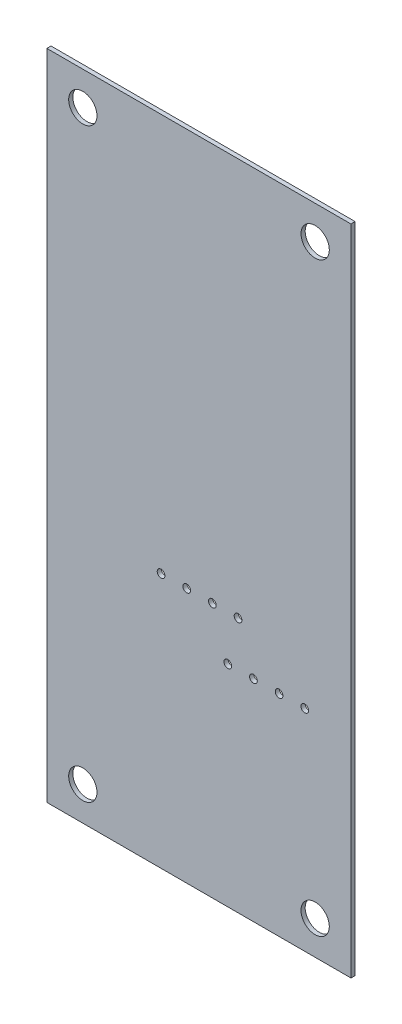
ISO-10303-21;
HEADER;
FILE_DESCRIPTION(('STEP AP214'),'2;1');
FILE_NAME('part.step','',(''),(''),'','','');
FILE_SCHEMA(('AUTOMOTIVE_DESIGN { 1 0 10303 214 1 1 1 1 }'));
ENDSEC;
DATA;
#1=APPLICATION_CONTEXT('core data for automotive mechanical design processes');
#2=APPLICATION_PROTOCOL_DEFINITION('international standard','automotive_design',2000,#1);
#3=PRODUCT_CONTEXT('',#1,'mechanical');
#4=PRODUCT('Part','Part','',(#3));
#5=PRODUCT_RELATED_PRODUCT_CATEGORY('part','',(#4));
#6=PRODUCT_DEFINITION_FORMATION('','',#4);
#7=PRODUCT_DEFINITION_CONTEXT('part definition',#1,'design');
#8=PRODUCT_DEFINITION('design','',#6,#7);
#9=PRODUCT_DEFINITION_SHAPE('','',#8);
#10=(LENGTH_UNIT() NAMED_UNIT(*) SI_UNIT(.MILLI.,.METRE.));
#11=(NAMED_UNIT(*) PLANE_ANGLE_UNIT() SI_UNIT($,.RADIAN.));
#12=(NAMED_UNIT(*) SI_UNIT($,.STERADIAN.) SOLID_ANGLE_UNIT());
#13=UNCERTAINTY_MEASURE_WITH_UNIT(LENGTH_MEASURE(1.E-05),#10,'distance_accuracy_value','');
#14=(GEOMETRIC_REPRESENTATION_CONTEXT(3) GLOBAL_UNCERTAINTY_ASSIGNED_CONTEXT((#13)) GLOBAL_UNIT_ASSIGNED_CONTEXT((#10,
#11,#12)) REPRESENTATION_CONTEXT('',''));
#15=CARTESIAN_POINT('',(0.,0.,0.));
#16=DIRECTION('',(0.,0.,1.));
#17=DIRECTION('',(1.,0.,0.));
#18=AXIS2_PLACEMENT_3D('',#15,#16,#17);
#19=CARTESIAN_POINT('',(0.,0.127,0.));
#20=DIRECTION('',(0.,1.,0.));
#21=DIRECTION('',(1.,0.,0.));
#22=AXIS2_PLACEMENT_3D('',#19,#20,#21);
#23=PLANE('',#22);
#24=DIRECTION('',(1.,0.,0.));
#25=VECTOR('',#24,1.);
#26=CARTESIAN_POINT('',(0.,0.127,0.41148));
#27=LINE('',#26,#25);
#28=CARTESIAN_POINT('',(0.,0.127,0.41148));
#29=VERTEX_POINT('',#28);
#30=CARTESIAN_POINT('',(30.099,0.127,0.41148));
#31=VERTEX_POINT('',#30);
#32=EDGE_CURVE('E10',#29,#31,#27,.T.);
#33=ORIENTED_EDGE('',*,*,#32,.F.);
#34=DIRECTION('',(0.,0.,1.));
#35=VECTOR('',#34,1.);
#36=CARTESIAN_POINT('',(0.,0.127,0.));
#37=LINE('',#36,#35);
#38=CARTESIAN_POINT('',(0.,0.127,0.));
#39=VERTEX_POINT('',#38);
#40=EDGE_CURVE('E23',#39,#29,#37,.T.);
#41=ORIENTED_EDGE('',*,*,#40,.F.);
#42=DIRECTION('',(1.,0.,0.));
#43=VECTOR('',#42,1.);
#44=CARTESIAN_POINT('',(0.,0.127,0.));
#45=LINE('',#44,#43);
#46=CARTESIAN_POINT('',(30.099,0.127,0.));
#47=VERTEX_POINT('',#46);
#48=EDGE_CURVE('E249',#39,#47,#45,.T.);
#49=ORIENTED_EDGE('',*,*,#48,.T.);
#50=DIRECTION('',(0.,0.,1.));
#51=VECTOR('',#50,1.);
#52=CARTESIAN_POINT('',(30.099,0.127,0.));
#53=LINE('',#52,#51);
#54=EDGE_CURVE('E36',#47,#31,#53,.T.);
#55=ORIENTED_EDGE('',*,*,#54,.T.);
#56=EDGE_LOOP('',(#33,#41,#49,#55));
#57=FACE_BOUND('',#56,.T.);
#58=ADVANCED_FACE('F16',(#57),#23,.F.);
#59=CARTESIAN_POINT('',(30.099,0.127,0.));
#60=DIRECTION('',(-1.,0.,0.));
#61=DIRECTION('',(0.,1.,0.));
#62=AXIS2_PLACEMENT_3D('',#59,#60,#61);
#63=PLANE('',#62);
#64=DIRECTION('',(0.,1.,0.));
#65=VECTOR('',#64,1.);
#66=CARTESIAN_POINT('',(30.099,0.127,0.41148));
#67=LINE('',#66,#65);
#68=CARTESIAN_POINT('',(30.099,64.77,0.41148));
#69=VERTEX_POINT('',#68);
#70=EDGE_CURVE('E245',#31,#69,#67,.T.);
#71=ORIENTED_EDGE('',*,*,#70,.F.);
#72=ORIENTED_EDGE('',*,*,#54,.F.);
#73=DIRECTION('',(0.,1.,0.));
#74=VECTOR('',#73,1.);
#75=CARTESIAN_POINT('',(30.099,0.127,0.));
#76=LINE('',#75,#74);
#77=CARTESIAN_POINT('',(30.099,64.77,0.));
#78=VERTEX_POINT('',#77);
#79=EDGE_CURVE('E242',#47,#78,#76,.T.);
#80=ORIENTED_EDGE('',*,*,#79,.T.);
#81=DIRECTION('',(0.,0.,1.));
#82=VECTOR('',#81,1.);
#83=CARTESIAN_POINT('',(30.099,64.77,0.));
#84=LINE('',#83,#82);
#85=EDGE_CURVE('E240',#78,#69,#84,.T.);
#86=ORIENTED_EDGE('',*,*,#85,.T.);
#87=EDGE_LOOP('',(#71,#72,#80,#86));
#88=FACE_BOUND('',#87,.T.);
#89=ADVANCED_FACE('F258',(#88),#63,.F.);
#90=CARTESIAN_POINT('',(30.099,64.77,0.));
#91=DIRECTION('',(0.,-1.,0.));
#92=DIRECTION('',(-1.,0.,0.));
#93=AXIS2_PLACEMENT_3D('',#90,#91,#92);
#94=PLANE('',#93);
#95=DIRECTION('',(-1.,0.,0.));
#96=VECTOR('',#95,1.);
#97=CARTESIAN_POINT('',(30.099,64.77,0.41148));
#98=LINE('',#97,#96);
#99=CARTESIAN_POINT('',(0.,64.77,0.41148));
#100=VERTEX_POINT('',#99);
#101=EDGE_CURVE('E237',#69,#100,#98,.T.);
#102=ORIENTED_EDGE('',*,*,#101,.F.);
#103=ORIENTED_EDGE('',*,*,#85,.F.);
#104=DIRECTION('',(-1.,0.,0.));
#105=VECTOR('',#104,1.);
#106=CARTESIAN_POINT('',(30.099,64.77,0.));
#107=LINE('',#106,#105);
#108=CARTESIAN_POINT('',(0.,64.77,0.));
#109=VERTEX_POINT('',#108);
#110=EDGE_CURVE('E234',#78,#109,#107,.T.);
#111=ORIENTED_EDGE('',*,*,#110,.T.);
#112=DIRECTION('',(0.,0.,1.));
#113=VECTOR('',#112,1.);
#114=CARTESIAN_POINT('',(0.,64.77,0.));
#115=LINE('',#114,#113);
#116=EDGE_CURVE('E232',#109,#100,#115,.T.);
#117=ORIENTED_EDGE('',*,*,#116,.T.);
#118=EDGE_LOOP('',(#102,#103,#111,#117));
#119=FACE_BOUND('',#118,.T.);
#120=ADVANCED_FACE('F264',(#119),#94,.F.);
#121=CARTESIAN_POINT('',(0.,64.77,0.));
#122=DIRECTION('',(1.,0.,0.));
#123=DIRECTION('',(0.,-1.,0.));
#124=AXIS2_PLACEMENT_3D('',#121,#122,#123);
#125=PLANE('',#124);
#126=DIRECTION('',(0.,-1.,0.));
#127=VECTOR('',#126,1.);
#128=CARTESIAN_POINT('',(0.,64.77,0.41148));
#129=LINE('',#128,#127);
#130=EDGE_CURVE('E229',#100,#29,#129,.T.);
#131=ORIENTED_EDGE('',*,*,#130,.F.);
#132=ORIENTED_EDGE('',*,*,#116,.F.);
#133=DIRECTION('',(0.,-1.,0.));
#134=VECTOR('',#133,1.);
#135=CARTESIAN_POINT('',(0.,64.77,0.));
#136=LINE('',#135,#134);
#137=EDGE_CURVE('E227',#109,#39,#136,.T.);
#138=ORIENTED_EDGE('',*,*,#137,.T.);
#139=ORIENTED_EDGE('',*,*,#40,.T.);
#140=EDGE_LOOP('',(#131,#132,#138,#139));
#141=FACE_BOUND('',#140,.T.);
#142=ADVANCED_FACE('F265',(#141),#125,.F.);
#143=CARTESIAN_POINT('',(3.556,3.468,0.));
#144=DIRECTION('',(0.,0.,-1.));
#145=DIRECTION('',(1.,0.,0.));
#146=AXIS2_PLACEMENT_3D('',#143,#144,#145);
#147=CYLINDRICAL_SURFACE('',#146,1.4);
#148=DIRECTION('',(0.,0.,1.));
#149=VECTOR('',#148,1.);
#150=CARTESIAN_POINT('',(4.956,3.468,0.));
#151=LINE('',#150,#149);
#152=CARTESIAN_POINT('',(4.956,3.468,0.));
#153=VERTEX_POINT('',#152);
#154=CARTESIAN_POINT('',(4.956,3.468,0.41148));
#155=VERTEX_POINT('',#154);
#156=EDGE_CURVE('E225',#153,#155,#151,.T.);
#157=ORIENTED_EDGE('',*,*,#156,.T.);
#158=CARTESIAN_POINT('',(3.556,3.468,0.41148));
#159=DIRECTION('',(0.,0.,1.));
#160=DIRECTION('',(1.,0.,0.));
#161=AXIS2_PLACEMENT_3D('',#158,#159,#160);
#162=CIRCLE('',#161,1.4);
#163=EDGE_CURVE('E222',#155,#155,#162,.T.);
#164=ORIENTED_EDGE('',*,*,#163,.T.);
#165=ORIENTED_EDGE('',*,*,#156,.F.);
#166=CARTESIAN_POINT('',(3.556,3.468,0.));
#167=DIRECTION('',(0.,0.,1.));
#168=DIRECTION('',(1.,0.,0.));
#169=AXIS2_PLACEMENT_3D('',#166,#167,#168);
#170=CIRCLE('',#169,1.4);
#171=EDGE_CURVE('E219',#153,#153,#170,.T.);
#172=ORIENTED_EDGE('',*,*,#171,.F.);
#173=EDGE_LOOP('',(#157,#164,#165,#172));
#174=FACE_BOUND('',#173,.T.);
#175=ADVANCED_FACE('F267',(#174),#147,.F.);
#176=CARTESIAN_POINT('',(17.907,20.955,0.));
#177=DIRECTION('',(0.,0.,-1.));
#178=DIRECTION('',(1.,0.,0.));
#179=AXIS2_PLACEMENT_3D('',#176,#177,#178);
#180=CYLINDRICAL_SURFACE('',#179,0.381);
#181=DIRECTION('',(0.,0.,1.));
#182=VECTOR('',#181,1.);
#183=CARTESIAN_POINT('',(18.288,20.955,0.));
#184=LINE('',#183,#182);
#185=CARTESIAN_POINT('',(18.288,20.955,0.));
#186=VERTEX_POINT('',#185);
#187=CARTESIAN_POINT('',(18.288,20.955,0.41148));
#188=VERTEX_POINT('',#187);
#189=EDGE_CURVE('E217',#186,#188,#184,.T.);
#190=ORIENTED_EDGE('',*,*,#189,.T.);
#191=CARTESIAN_POINT('',(17.907,20.955,0.41148));
#192=DIRECTION('',(0.,0.,1.));
#193=DIRECTION('',(1.,0.,0.));
#194=AXIS2_PLACEMENT_3D('',#191,#192,#193);
#195=CIRCLE('',#194,0.381);
#196=EDGE_CURVE('E214',#188,#188,#195,.T.);
#197=ORIENTED_EDGE('',*,*,#196,.T.);
#198=ORIENTED_EDGE('',*,*,#189,.F.);
#199=CARTESIAN_POINT('',(17.907,20.955,0.));
#200=DIRECTION('',(0.,0.,1.));
#201=DIRECTION('',(1.,0.,0.));
#202=AXIS2_PLACEMENT_3D('',#199,#200,#201);
#203=CIRCLE('',#202,0.381);
#204=EDGE_CURVE('E211',#186,#186,#203,.T.);
#205=ORIENTED_EDGE('',*,*,#204,.F.);
#206=EDGE_LOOP('',(#190,#197,#198,#205));
#207=FACE_BOUND('',#206,.T.);
#208=ADVANCED_FACE('F274',(#207),#180,.F.);
#209=CARTESIAN_POINT('',(11.303,25.4,0.));
#210=DIRECTION('',(0.,0.,-1.));
#211=DIRECTION('',(1.,0.,0.));
#212=AXIS2_PLACEMENT_3D('',#209,#210,#211);
#213=CYLINDRICAL_SURFACE('',#212,0.381);
#214=DIRECTION('',(0.,0.,1.));
#215=VECTOR('',#214,1.);
#216=CARTESIAN_POINT('',(11.684,25.4,0.));
#217=LINE('',#216,#215);
#218=CARTESIAN_POINT('',(11.684,25.4,0.));
#219=VERTEX_POINT('',#218);
#220=CARTESIAN_POINT('',(11.684,25.4,0.41148));
#221=VERTEX_POINT('',#220);
#222=EDGE_CURVE('E209',#219,#221,#217,.T.);
#223=ORIENTED_EDGE('',*,*,#222,.T.);
#224=CARTESIAN_POINT('',(11.303,25.4,0.41148));
#225=DIRECTION('',(0.,0.,1.));
#226=DIRECTION('',(1.,0.,0.));
#227=AXIS2_PLACEMENT_3D('',#224,#225,#226);
#228=CIRCLE('',#227,0.381);
#229=EDGE_CURVE('E206',#221,#221,#228,.T.);
#230=ORIENTED_EDGE('',*,*,#229,.T.);
#231=ORIENTED_EDGE('',*,*,#222,.F.);
#232=CARTESIAN_POINT('',(11.303,25.4,0.));
#233=DIRECTION('',(0.,0.,1.));
#234=DIRECTION('',(1.,0.,0.));
#235=AXIS2_PLACEMENT_3D('',#232,#233,#234);
#236=CIRCLE('',#235,0.381);
#237=EDGE_CURVE('E203',#219,#219,#236,.T.);
#238=ORIENTED_EDGE('',*,*,#237,.F.);
#239=EDGE_LOOP('',(#223,#230,#231,#238));
#240=FACE_BOUND('',#239,.T.);
#241=ADVANCED_FACE('F312',(#240),#213,.F.);
#242=CARTESIAN_POINT('',(3.556,61.468,0.));
#243=DIRECTION('',(0.,0.,-1.));
#244=DIRECTION('',(1.,0.,0.));
#245=AXIS2_PLACEMENT_3D('',#242,#243,#244);
#246=CYLINDRICAL_SURFACE('',#245,1.4);
#247=DIRECTION('',(0.,0.,1.));
#248=VECTOR('',#247,1.);
#249=CARTESIAN_POINT('',(4.956,61.468,0.));
#250=LINE('',#249,#248);
#251=CARTESIAN_POINT('',(4.956,61.468,0.));
#252=VERTEX_POINT('',#251);
#253=CARTESIAN_POINT('',(4.956,61.468,0.41148));
#254=VERTEX_POINT('',#253);
#255=EDGE_CURVE('E201',#252,#254,#250,.T.);
#256=ORIENTED_EDGE('',*,*,#255,.T.);
#257=CARTESIAN_POINT('',(3.556,61.468,0.41148));
#258=DIRECTION('',(0.,0.,1.));
#259=DIRECTION('',(1.,0.,0.));
#260=AXIS2_PLACEMENT_3D('',#257,#258,#259);
#261=CIRCLE('',#260,1.4);
#262=EDGE_CURVE('E198',#254,#254,#261,.T.);
#263=ORIENTED_EDGE('',*,*,#262,.T.);
#264=ORIENTED_EDGE('',*,*,#255,.F.);
#265=CARTESIAN_POINT('',(3.556,61.468,0.));
#266=DIRECTION('',(0.,0.,1.));
#267=DIRECTION('',(1.,0.,0.));
#268=AXIS2_PLACEMENT_3D('',#265,#266,#267);
#269=CIRCLE('',#268,1.4);
#270=EDGE_CURVE('E195',#252,#252,#269,.T.);
#271=ORIENTED_EDGE('',*,*,#270,.F.);
#272=EDGE_LOOP('',(#256,#263,#264,#271));
#273=FACE_BOUND('',#272,.T.);
#274=ADVANCED_FACE('F322',(#273),#246,.F.);
#275=CARTESIAN_POINT('',(16.383,25.4,0.));
#276=DIRECTION('',(0.,0.,-1.));
#277=DIRECTION('',(1.,0.,0.));
#278=AXIS2_PLACEMENT_3D('',#275,#276,#277);
#279=CYLINDRICAL_SURFACE('',#278,0.381);
#280=DIRECTION('',(0.,0.,1.));
#281=VECTOR('',#280,1.);
#282=CARTESIAN_POINT('',(16.764,25.4,0.));
#283=LINE('',#282,#281);
#284=CARTESIAN_POINT('',(16.764,25.4,0.));
#285=VERTEX_POINT('',#284);
#286=CARTESIAN_POINT('',(16.764,25.4,0.41148));
#287=VERTEX_POINT('',#286);
#288=EDGE_CURVE('E193',#285,#287,#283,.T.);
#289=ORIENTED_EDGE('',*,*,#288,.T.);
#290=CARTESIAN_POINT('',(16.383,25.4,0.41148));
#291=DIRECTION('',(0.,0.,1.));
#292=DIRECTION('',(1.,0.,0.));
#293=AXIS2_PLACEMENT_3D('',#290,#291,#292);
#294=CIRCLE('',#293,0.381);
#295=EDGE_CURVE('E190',#287,#287,#294,.T.);
#296=ORIENTED_EDGE('',*,*,#295,.T.);
#297=ORIENTED_EDGE('',*,*,#288,.F.);
#298=CARTESIAN_POINT('',(16.383,25.4,0.));
#299=DIRECTION('',(0.,0.,1.));
#300=DIRECTION('',(1.,0.,0.));
#301=AXIS2_PLACEMENT_3D('',#298,#299,#300);
#302=CIRCLE('',#301,0.381);
#303=EDGE_CURVE('E187',#285,#285,#302,.T.);
#304=ORIENTED_EDGE('',*,*,#303,.F.);
#305=EDGE_LOOP('',(#289,#296,#297,#304));
#306=FACE_BOUND('',#305,.T.);
#307=ADVANCED_FACE('F332',(#306),#279,.F.);
#308=CARTESIAN_POINT('',(13.843,25.4,0.));
#309=DIRECTION('',(0.,0.,-1.));
#310=DIRECTION('',(1.,0.,0.));
#311=AXIS2_PLACEMENT_3D('',#308,#309,#310);
#312=CYLINDRICAL_SURFACE('',#311,0.381);
#313=DIRECTION('',(0.,0.,1.));
#314=VECTOR('',#313,1.);
#315=CARTESIAN_POINT('',(14.224,25.4,0.));
#316=LINE('',#315,#314);
#317=CARTESIAN_POINT('',(14.224,25.4,0.));
#318=VERTEX_POINT('',#317);
#319=CARTESIAN_POINT('',(14.224,25.4,0.41148));
#320=VERTEX_POINT('',#319);
#321=EDGE_CURVE('E185',#318,#320,#316,.T.);
#322=ORIENTED_EDGE('',*,*,#321,.T.);
#323=CARTESIAN_POINT('',(13.843,25.4,0.41148));
#324=DIRECTION('',(0.,0.,1.));
#325=DIRECTION('',(1.,0.,0.));
#326=AXIS2_PLACEMENT_3D('',#323,#324,#325);
#327=CIRCLE('',#326,0.381);
#328=EDGE_CURVE('E182',#320,#320,#327,.T.);
#329=ORIENTED_EDGE('',*,*,#328,.T.);
#330=ORIENTED_EDGE('',*,*,#321,.F.);
#331=CARTESIAN_POINT('',(13.843,25.4,0.));
#332=DIRECTION('',(0.,0.,1.));
#333=DIRECTION('',(1.,0.,0.));
#334=AXIS2_PLACEMENT_3D('',#331,#332,#333);
#335=CIRCLE('',#334,0.381);
#336=EDGE_CURVE('E179',#318,#318,#335,.T.);
#337=ORIENTED_EDGE('',*,*,#336,.F.);
#338=EDGE_LOOP('',(#322,#329,#330,#337));
#339=FACE_BOUND('',#338,.T.);
#340=ADVANCED_FACE('F342',(#339),#312,.F.);
#341=CARTESIAN_POINT('',(20.447,20.955,0.));
#342=DIRECTION('',(0.,0.,-1.));
#343=DIRECTION('',(1.,0.,0.));
#344=AXIS2_PLACEMENT_3D('',#341,#342,#343);
#345=CYLINDRICAL_SURFACE('',#344,0.381);
#346=DIRECTION('',(0.,0.,1.));
#347=VECTOR('',#346,1.);
#348=CARTESIAN_POINT('',(20.828,20.955,0.));
#349=LINE('',#348,#347);
#350=CARTESIAN_POINT('',(20.828,20.955,0.));
#351=VERTEX_POINT('',#350);
#352=CARTESIAN_POINT('',(20.828,20.955,0.41148));
#353=VERTEX_POINT('',#352);
#354=EDGE_CURVE('E177',#351,#353,#349,.T.);
#355=ORIENTED_EDGE('',*,*,#354,.T.);
#356=CARTESIAN_POINT('',(20.447,20.955,0.41148));
#357=DIRECTION('',(0.,0.,1.));
#358=DIRECTION('',(1.,0.,0.));
#359=AXIS2_PLACEMENT_3D('',#356,#357,#358);
#360=CIRCLE('',#359,0.381);
#361=EDGE_CURVE('E174',#353,#353,#360,.T.);
#362=ORIENTED_EDGE('',*,*,#361,.T.);
#363=ORIENTED_EDGE('',*,*,#354,.F.);
#364=CARTESIAN_POINT('',(20.447,20.955,0.));
#365=DIRECTION('',(0.,0.,1.));
#366=DIRECTION('',(1.,0.,0.));
#367=AXIS2_PLACEMENT_3D('',#364,#365,#366);
#368=CIRCLE('',#367,0.381);
#369=EDGE_CURVE('E171',#351,#351,#368,.T.);
#370=ORIENTED_EDGE('',*,*,#369,.F.);
#371=EDGE_LOOP('',(#355,#362,#363,#370));
#372=FACE_BOUND('',#371,.T.);
#373=ADVANCED_FACE('F352',(#372),#345,.F.);
#374=CARTESIAN_POINT('',(26.556,3.468,0.));
#375=DIRECTION('',(0.,0.,-1.));
#376=DIRECTION('',(1.,0.,0.));
#377=AXIS2_PLACEMENT_3D('',#374,#375,#376);
#378=CYLINDRICAL_SURFACE('',#377,1.4);
#379=DIRECTION('',(0.,0.,1.));
#380=VECTOR('',#379,1.);
#381=CARTESIAN_POINT('',(27.956,3.468,0.));
#382=LINE('',#381,#380);
#383=CARTESIAN_POINT('',(27.956,3.468,0.));
#384=VERTEX_POINT('',#383);
#385=CARTESIAN_POINT('',(27.956,3.468,0.41148));
#386=VERTEX_POINT('',#385);
#387=EDGE_CURVE('E169',#384,#386,#382,.T.);
#388=ORIENTED_EDGE('',*,*,#387,.T.);
#389=CARTESIAN_POINT('',(26.556,3.468,0.41148));
#390=DIRECTION('',(0.,0.,1.));
#391=DIRECTION('',(1.,0.,0.));
#392=AXIS2_PLACEMENT_3D('',#389,#390,#391);
#393=CIRCLE('',#392,1.4);
#394=EDGE_CURVE('E166',#386,#386,#393,.T.);
#395=ORIENTED_EDGE('',*,*,#394,.T.);
#396=ORIENTED_EDGE('',*,*,#387,.F.);
#397=CARTESIAN_POINT('',(26.556,3.468,0.));
#398=DIRECTION('',(0.,0.,1.));
#399=DIRECTION('',(1.,0.,0.));
#400=AXIS2_PLACEMENT_3D('',#397,#398,#399);
#401=CIRCLE('',#400,1.4);
#402=EDGE_CURVE('E163',#384,#384,#401,.T.);
#403=ORIENTED_EDGE('',*,*,#402,.F.);
#404=EDGE_LOOP('',(#388,#395,#396,#403));
#405=FACE_BOUND('',#404,.T.);
#406=ADVANCED_FACE('F362',(#405),#378,.F.);
#407=CARTESIAN_POINT('',(22.987,20.955,0.));
#408=DIRECTION('',(0.,0.,-1.));
#409=DIRECTION('',(1.,0.,0.));
#410=AXIS2_PLACEMENT_3D('',#407,#408,#409);
#411=CYLINDRICAL_SURFACE('',#410,0.381);
#412=DIRECTION('',(0.,0.,1.));
#413=VECTOR('',#412,1.);
#414=CARTESIAN_POINT('',(23.368,20.955,0.));
#415=LINE('',#414,#413);
#416=CARTESIAN_POINT('',(23.368,20.955,0.));
#417=VERTEX_POINT('',#416);
#418=CARTESIAN_POINT('',(23.368,20.955,0.41148));
#419=VERTEX_POINT('',#418);
#420=EDGE_CURVE('E161',#417,#419,#415,.T.);
#421=ORIENTED_EDGE('',*,*,#420,.T.);
#422=CARTESIAN_POINT('',(22.987,20.955,0.41148));
#423=DIRECTION('',(0.,0.,1.));
#424=DIRECTION('',(1.,0.,0.));
#425=AXIS2_PLACEMENT_3D('',#422,#423,#424);
#426=CIRCLE('',#425,0.381);
#427=EDGE_CURVE('E158',#419,#419,#426,.T.);
#428=ORIENTED_EDGE('',*,*,#427,.T.);
#429=ORIENTED_EDGE('',*,*,#420,.F.);
#430=CARTESIAN_POINT('',(22.987,20.955,0.));
#431=DIRECTION('',(0.,0.,1.));
#432=DIRECTION('',(1.,0.,0.));
#433=AXIS2_PLACEMENT_3D('',#430,#431,#432);
#434=CIRCLE('',#433,0.381);
#435=EDGE_CURVE('E155',#417,#417,#434,.T.);
#436=ORIENTED_EDGE('',*,*,#435,.F.);
#437=EDGE_LOOP('',(#421,#428,#429,#436));
#438=FACE_BOUND('',#437,.T.);
#439=ADVANCED_FACE('F372',(#438),#411,.F.);
#440=CARTESIAN_POINT('',(18.923,25.4,0.));
#441=DIRECTION('',(0.,0.,-1.));
#442=DIRECTION('',(1.,0.,0.));
#443=AXIS2_PLACEMENT_3D('',#440,#441,#442);
#444=CYLINDRICAL_SURFACE('',#443,0.381);
#445=DIRECTION('',(0.,0.,1.));
#446=VECTOR('',#445,1.);
#447=CARTESIAN_POINT('',(19.304,25.4,0.));
#448=LINE('',#447,#446);
#449=CARTESIAN_POINT('',(19.304,25.4,0.));
#450=VERTEX_POINT('',#449);
#451=CARTESIAN_POINT('',(19.304,25.4,0.41148));
#452=VERTEX_POINT('',#451);
#453=EDGE_CURVE('E153',#450,#452,#448,.T.);
#454=ORIENTED_EDGE('',*,*,#453,.T.);
#455=CARTESIAN_POINT('',(18.923,25.4,0.41148));
#456=DIRECTION('',(0.,0.,1.));
#457=DIRECTION('',(1.,0.,0.));
#458=AXIS2_PLACEMENT_3D('',#455,#456,#457);
#459=CIRCLE('',#458,0.381);
#460=EDGE_CURVE('E150',#452,#452,#459,.T.);
#461=ORIENTED_EDGE('',*,*,#460,.T.);
#462=ORIENTED_EDGE('',*,*,#453,.F.);
#463=CARTESIAN_POINT('',(18.923,25.4,0.));
#464=DIRECTION('',(0.,0.,1.));
#465=DIRECTION('',(1.,0.,0.));
#466=AXIS2_PLACEMENT_3D('',#463,#464,#465);
#467=CIRCLE('',#466,0.381);
#468=EDGE_CURVE('E147',#450,#450,#467,.T.);
#469=ORIENTED_EDGE('',*,*,#468,.F.);
#470=EDGE_LOOP('',(#454,#461,#462,#469));
#471=FACE_BOUND('',#470,.T.);
#472=ADVANCED_FACE('F382',(#471),#444,.F.);
#473=CARTESIAN_POINT('',(25.527,20.955,0.));
#474=DIRECTION('',(0.,0.,-1.));
#475=DIRECTION('',(1.,0.,0.));
#476=AXIS2_PLACEMENT_3D('',#473,#474,#475);
#477=CYLINDRICAL_SURFACE('',#476,0.381);
#478=DIRECTION('',(0.,0.,1.));
#479=VECTOR('',#478,1.);
#480=CARTESIAN_POINT('',(25.908,20.955,0.));
#481=LINE('',#480,#479);
#482=CARTESIAN_POINT('',(25.908,20.955,0.));
#483=VERTEX_POINT('',#482);
#484=CARTESIAN_POINT('',(25.908,20.955,0.41148));
#485=VERTEX_POINT('',#484);
#486=EDGE_CURVE('E145',#483,#485,#481,.T.);
#487=ORIENTED_EDGE('',*,*,#486,.T.);
#488=CARTESIAN_POINT('',(25.527,20.955,0.41148));
#489=DIRECTION('',(0.,0.,1.));
#490=DIRECTION('',(1.,0.,0.));
#491=AXIS2_PLACEMENT_3D('',#488,#489,#490);
#492=CIRCLE('',#491,0.381);
#493=EDGE_CURVE('E142',#485,#485,#492,.T.);
#494=ORIENTED_EDGE('',*,*,#493,.T.);
#495=ORIENTED_EDGE('',*,*,#486,.F.);
#496=CARTESIAN_POINT('',(25.527,20.955,0.));
#497=DIRECTION('',(0.,0.,1.));
#498=DIRECTION('',(1.,0.,0.));
#499=AXIS2_PLACEMENT_3D('',#496,#497,#498);
#500=CIRCLE('',#499,0.381);
#501=EDGE_CURVE('E133',#483,#483,#500,.T.);
#502=ORIENTED_EDGE('',*,*,#501,.F.);
#503=EDGE_LOOP('',(#487,#494,#495,#502));
#504=FACE_BOUND('',#503,.T.);
#505=ADVANCED_FACE('F392',(#504),#477,.F.);
#506=CARTESIAN_POINT('',(26.556,61.468,0.));
#507=DIRECTION('',(0.,0.,-1.));
#508=DIRECTION('',(1.,0.,0.));
#509=AXIS2_PLACEMENT_3D('',#506,#507,#508);
#510=CYLINDRICAL_SURFACE('',#509,1.4);
#511=DIRECTION('',(0.,0.,1.));
#512=VECTOR('',#511,1.);
#513=CARTESIAN_POINT('',(27.956,61.468,0.));
#514=LINE('',#513,#512);
#515=CARTESIAN_POINT('',(27.956,61.468,0.));
#516=VERTEX_POINT('',#515);
#517=CARTESIAN_POINT('',(27.956,61.468,0.41148));
#518=VERTEX_POINT('',#517);
#519=EDGE_CURVE('E127',#516,#518,#514,.T.);
#520=ORIENTED_EDGE('',*,*,#519,.T.);
#521=CARTESIAN_POINT('',(26.556,61.468,0.41148));
#522=DIRECTION('',(0.,0.,1.));
#523=DIRECTION('',(1.,0.,0.));
#524=AXIS2_PLACEMENT_3D('',#521,#522,#523);
#525=CIRCLE('',#524,1.4);
#526=EDGE_CURVE('E132',#518,#518,#525,.T.);
#527=ORIENTED_EDGE('',*,*,#526,.T.);
#528=ORIENTED_EDGE('',*,*,#519,.F.);
#529=CARTESIAN_POINT('',(26.556,61.468,0.));
#530=DIRECTION('',(0.,0.,1.));
#531=DIRECTION('',(1.,0.,0.));
#532=AXIS2_PLACEMENT_3D('',#529,#530,#531);
#533=CIRCLE('',#532,1.4);
#534=EDGE_CURVE('E130',#516,#516,#533,.T.);
#535=ORIENTED_EDGE('',*,*,#534,.F.);
#536=EDGE_LOOP('',(#520,#527,#528,#535));
#537=FACE_BOUND('',#536,.T.);
#538=ADVANCED_FACE('F129',(#537),#510,.F.);
#539=CARTESIAN_POINT('',(15.0495,32.4485,0.));
#540=DIRECTION('',(0.,0.,1.));
#541=DIRECTION('',(1.,0.,0.));
#542=AXIS2_PLACEMENT_3D('',#539,#540,#541);
#543=PLANE('',#542);
#544=ORIENTED_EDGE('',*,*,#137,.F.);
#545=ORIENTED_EDGE('',*,*,#110,.F.);
#546=ORIENTED_EDGE('',*,*,#79,.F.);
#547=ORIENTED_EDGE('',*,*,#48,.F.);
#548=EDGE_LOOP('',(#544,#545,#546,#547));
#549=FACE_BOUND('',#548,.T.);
#550=ORIENTED_EDGE('',*,*,#171,.T.);
#551=EDGE_LOOP('',(#550));
#552=FACE_BOUND('',#551,.T.);
#553=ORIENTED_EDGE('',*,*,#204,.T.);
#554=EDGE_LOOP('',(#553));
#555=FACE_BOUND('',#554,.T.);
#556=ORIENTED_EDGE('',*,*,#237,.T.);
#557=EDGE_LOOP('',(#556));
#558=FACE_BOUND('',#557,.T.);
#559=ORIENTED_EDGE('',*,*,#270,.T.);
#560=EDGE_LOOP('',(#559));
#561=FACE_BOUND('',#560,.T.);
#562=ORIENTED_EDGE('',*,*,#303,.T.);
#563=EDGE_LOOP('',(#562));
#564=FACE_BOUND('',#563,.T.);
#565=ORIENTED_EDGE('',*,*,#336,.T.);
#566=EDGE_LOOP('',(#565));
#567=FACE_BOUND('',#566,.T.);
#568=ORIENTED_EDGE('',*,*,#369,.T.);
#569=EDGE_LOOP('',(#568));
#570=FACE_BOUND('',#569,.T.);
#571=ORIENTED_EDGE('',*,*,#402,.T.);
#572=EDGE_LOOP('',(#571));
#573=FACE_BOUND('',#572,.T.);
#574=ORIENTED_EDGE('',*,*,#435,.T.);
#575=EDGE_LOOP('',(#574));
#576=FACE_BOUND('',#575,.T.);
#577=ORIENTED_EDGE('',*,*,#468,.T.);
#578=EDGE_LOOP('',(#577));
#579=FACE_BOUND('',#578,.T.);
#580=ORIENTED_EDGE('',*,*,#501,.T.);
#581=EDGE_LOOP('',(#580));
#582=FACE_BOUND('',#581,.T.);
#583=ORIENTED_EDGE('',*,*,#534,.T.);
#584=EDGE_LOOP('',(#583));
#585=FACE_BOUND('',#584,.T.);
#586=ADVANCED_FACE('F136',(#549,#552,#555,#558,#561,#564,#567,#570,#573,#576,#579,#582,#585),
#543,.F.);
#587=CARTESIAN_POINT('',(15.0495,32.4485,0.41148));
#588=DIRECTION('',(0.,0.,1.));
#589=DIRECTION('',(1.,0.,0.));
#590=AXIS2_PLACEMENT_3D('',#587,#588,#589);
#591=PLANE('',#590);
#592=ORIENTED_EDGE('',*,*,#32,.T.);
#593=ORIENTED_EDGE('',*,*,#70,.T.);
#594=ORIENTED_EDGE('',*,*,#101,.T.);
#595=ORIENTED_EDGE('',*,*,#130,.T.);
#596=EDGE_LOOP('',(#592,#593,#594,#595));
#597=FACE_BOUND('',#596,.T.);
#598=ORIENTED_EDGE('',*,*,#163,.F.);
#599=EDGE_LOOP('',(#598));
#600=FACE_BOUND('',#599,.T.);
#601=ORIENTED_EDGE('',*,*,#196,.F.);
#602=EDGE_LOOP('',(#601));
#603=FACE_BOUND('',#602,.T.);
#604=ORIENTED_EDGE('',*,*,#229,.F.);
#605=EDGE_LOOP('',(#604));
#606=FACE_BOUND('',#605,.T.);
#607=ORIENTED_EDGE('',*,*,#262,.F.);
#608=EDGE_LOOP('',(#607));
#609=FACE_BOUND('',#608,.T.);
#610=ORIENTED_EDGE('',*,*,#295,.F.);
#611=EDGE_LOOP('',(#610));
#612=FACE_BOUND('',#611,.T.);
#613=ORIENTED_EDGE('',*,*,#328,.F.);
#614=EDGE_LOOP('',(#613));
#615=FACE_BOUND('',#614,.T.);
#616=ORIENTED_EDGE('',*,*,#361,.F.);
#617=EDGE_LOOP('',(#616));
#618=FACE_BOUND('',#617,.T.);
#619=ORIENTED_EDGE('',*,*,#394,.F.);
#620=EDGE_LOOP('',(#619));
#621=FACE_BOUND('',#620,.T.);
#622=ORIENTED_EDGE('',*,*,#427,.F.);
#623=EDGE_LOOP('',(#622));
#624=FACE_BOUND('',#623,.T.);
#625=ORIENTED_EDGE('',*,*,#460,.F.);
#626=EDGE_LOOP('',(#625));
#627=FACE_BOUND('',#626,.T.);
#628=ORIENTED_EDGE('',*,*,#493,.F.);
#629=EDGE_LOOP('',(#628));
#630=FACE_BOUND('',#629,.T.);
#631=ORIENTED_EDGE('',*,*,#526,.F.);
#632=EDGE_LOOP('',(#631));
#633=FACE_BOUND('',#632,.T.);
#634=ADVANCED_FACE('F261',(#597,#600,#603,#606,#609,#612,#615,#618,#621,#624,#627,#630,#633),
#591,.T.);
#635=CLOSED_SHELL('',(#58,#89,#120,#142,#175,#208,#241,#274,#307,#340,#373,#406,#439,#472,#505,
#538,#586,#634));
#636=MANIFOLD_SOLID_BREP('B1',#635);
#637=ADVANCED_BREP_SHAPE_REPRESENTATION('',(#18,#636),#14);
#638=SHAPE_DEFINITION_REPRESENTATION(#9,#637);
ENDSEC;
END-ISO-10303-21;
